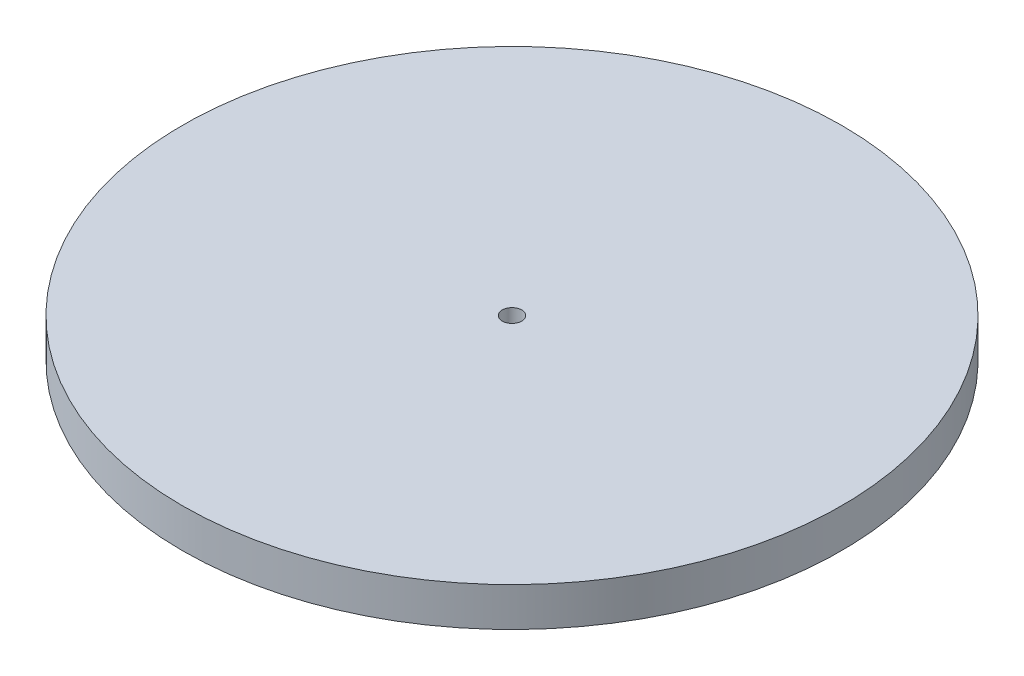
ISO-10303-21;
HEADER;
FILE_DESCRIPTION(('STEP AP214'),'2;1');
FILE_NAME('part.step','',(''),(''),'','','');
FILE_SCHEMA(('AUTOMOTIVE_DESIGN { 1 0 10303 214 1 1 1 1 }'));
ENDSEC;
DATA;
#1=APPLICATION_CONTEXT('core data for automotive mechanical design processes');
#2=APPLICATION_PROTOCOL_DEFINITION('international standard','automotive_design',2000,#1);
#3=PRODUCT_CONTEXT('',#1,'mechanical');
#4=PRODUCT('Part','Part','',(#3));
#5=PRODUCT_RELATED_PRODUCT_CATEGORY('part','',(#4));
#6=PRODUCT_DEFINITION_FORMATION('','',#4);
#7=PRODUCT_DEFINITION_CONTEXT('part definition',#1,'design');
#8=PRODUCT_DEFINITION('design','',#6,#7);
#9=PRODUCT_DEFINITION_SHAPE('','',#8);
#10=(LENGTH_UNIT() NAMED_UNIT(*) SI_UNIT(.MILLI.,.METRE.));
#11=(NAMED_UNIT(*) PLANE_ANGLE_UNIT() SI_UNIT($,.RADIAN.));
#12=(NAMED_UNIT(*) SI_UNIT($,.STERADIAN.) SOLID_ANGLE_UNIT());
#13=UNCERTAINTY_MEASURE_WITH_UNIT(LENGTH_MEASURE(1.E-05),#10,'distance_accuracy_value','');
#14=(GEOMETRIC_REPRESENTATION_CONTEXT(3) GLOBAL_UNCERTAINTY_ASSIGNED_CONTEXT((#13)) GLOBAL_UNIT_ASSIGNED_CONTEXT((#10,
#11,#12)) REPRESENTATION_CONTEXT('',''));
#15=CARTESIAN_POINT('',(0.,0.,0.));
#16=DIRECTION('',(0.,0.,1.));
#17=DIRECTION('',(1.,0.,0.));
#18=AXIS2_PLACEMENT_3D('',#15,#16,#17);
#19=CARTESIAN_POINT('',(0.,1.5,0.));
#20=DIRECTION('',(0.,-1.,0.));
#21=DIRECTION('',(0.,0.,-1.));
#22=AXIS2_PLACEMENT_3D('',#19,#20,#21);
#23=CYLINDRICAL_SURFACE('',#22,25.4);
#24=CARTESIAN_POINT('',(0.,1.5,0.));
#25=DIRECTION('',(0.,1.,0.));
#26=DIRECTION('',(0.,0.,1.));
#27=AXIS2_PLACEMENT_3D('',#24,#25,#26);
#28=CIRCLE('',#27,25.4);
#29=CARTESIAN_POINT('',(0.,1.5,25.4));
#30=VERTEX_POINT('',#29);
#31=EDGE_CURVE('E10',#30,#30,#28,.T.);
#32=ORIENTED_EDGE('',*,*,#31,.F.);
#33=EDGE_LOOP('',(#32));
#34=FACE_BOUND('',#33,.T.);
#35=CARTESIAN_POINT('',(0.,-1.5,0.));
#36=DIRECTION('',(0.,1.,0.));
#37=DIRECTION('',(0.,0.,1.));
#38=AXIS2_PLACEMENT_3D('',#35,#36,#37);
#39=CIRCLE('',#38,25.4);
#40=CARTESIAN_POINT('',(0.,-1.5,25.4));
#41=VERTEX_POINT('',#40);
#42=EDGE_CURVE('E33',#41,#41,#39,.T.);
#43=ORIENTED_EDGE('',*,*,#42,.T.);
#44=EDGE_LOOP('',(#43));
#45=FACE_BOUND('',#44,.T.);
#46=ADVANCED_FACE('F30',(#34,#45),#23,.T.);
#47=CARTESIAN_POINT('',(0.,1.5,0.));
#48=DIRECTION('',(0.,1.,0.));
#49=DIRECTION('',(0.,0.,1.));
#50=AXIS2_PLACEMENT_3D('',#47,#48,#49);
#51=PLANE('',#50);
#52=CARTESIAN_POINT('',(0.,1.5,0.));
#53=DIRECTION('',(0.,1.,0.));
#54=DIRECTION('',(0.,0.,1.));
#55=AXIS2_PLACEMENT_3D('',#52,#53,#54);
#56=CIRCLE('',#55,0.75);
#57=CARTESIAN_POINT('',(0.,1.5,0.75));
#58=VERTEX_POINT('',#57);
#59=EDGE_CURVE('E42',#58,#58,#56,.T.);
#60=ORIENTED_EDGE('',*,*,#59,.F.);
#61=EDGE_LOOP('',(#60));
#62=FACE_BOUND('',#61,.T.);
#63=ORIENTED_EDGE('',*,*,#31,.T.);
#64=EDGE_LOOP('',(#63));
#65=FACE_BOUND('',#64,.T.);
#66=ADVANCED_FACE('F57',(#62,#65),#51,.T.);
#67=CARTESIAN_POINT('',(0.,-1.5,0.));
#68=DIRECTION('',(0.,1.,0.));
#69=DIRECTION('',(0.,0.,1.));
#70=AXIS2_PLACEMENT_3D('',#67,#68,#69);
#71=PLANE('',#70);
#72=CARTESIAN_POINT('',(0.,-1.5,0.));
#73=DIRECTION('',(0.,1.,0.));
#74=DIRECTION('',(0.,0.,1.));
#75=AXIS2_PLACEMENT_3D('',#72,#73,#74);
#76=CIRCLE('',#75,0.75);
#77=CARTESIAN_POINT('',(0.,-1.5,0.75));
#78=VERTEX_POINT('',#77);
#79=EDGE_CURVE('E40',#78,#78,#76,.T.);
#80=ORIENTED_EDGE('',*,*,#79,.T.);
#81=EDGE_LOOP('',(#80));
#82=FACE_BOUND('',#81,.T.);
#83=ORIENTED_EDGE('',*,*,#42,.F.);
#84=EDGE_LOOP('',(#83));
#85=FACE_BOUND('',#84,.T.);
#86=ADVANCED_FACE('F48',(#82,#85),#71,.F.);
#87=CARTESIAN_POINT('',(0.,-1.5,0.));
#88=DIRECTION('',(0.,1.,0.));
#89=DIRECTION('',(0.,0.,1.));
#90=AXIS2_PLACEMENT_3D('',#87,#88,#89);
#91=CYLINDRICAL_SURFACE('',#90,0.75);
#92=ORIENTED_EDGE('',*,*,#79,.F.);
#93=EDGE_LOOP('',(#92));
#94=FACE_BOUND('',#93,.T.);
#95=ORIENTED_EDGE('',*,*,#59,.T.);
#96=EDGE_LOOP('',(#95));
#97=FACE_BOUND('',#96,.T.);
#98=ADVANCED_FACE('F51',(#94,#97),#91,.F.);
#99=CLOSED_SHELL('',(#46,#66,#86,#98));
#100=MANIFOLD_SOLID_BREP('B2',#99);
#101=ADVANCED_BREP_SHAPE_REPRESENTATION('',(#18,#100),#14);
#102=SHAPE_DEFINITION_REPRESENTATION(#9,#101);
ENDSEC;
END-ISO-10303-21;
